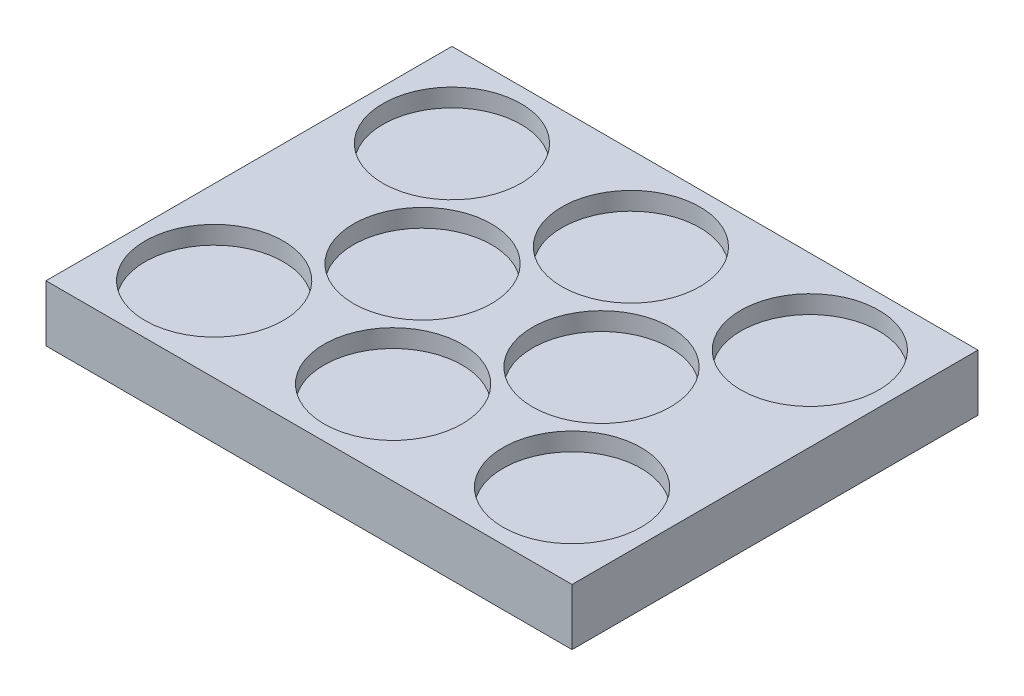
ISO-10303-21;
HEADER;
FILE_DESCRIPTION(('STEP AP214'),'2;1');
FILE_NAME('part.step','',(''),(''),'','','');
FILE_SCHEMA(('AUTOMOTIVE_DESIGN { 1 0 10303 214 1 1 1 1 }'));
ENDSEC;
DATA;
#1=APPLICATION_CONTEXT('core data for automotive mechanical design processes');
#2=APPLICATION_PROTOCOL_DEFINITION('international standard','automotive_design',2000,#1);
#3=PRODUCT_CONTEXT('',#1,'mechanical');
#4=PRODUCT('Part','Part','',(#3));
#5=PRODUCT_RELATED_PRODUCT_CATEGORY('part','',(#4));
#6=PRODUCT_DEFINITION_FORMATION('','',#4);
#7=PRODUCT_DEFINITION_CONTEXT('part definition',#1,'design');
#8=PRODUCT_DEFINITION('design','',#6,#7);
#9=PRODUCT_DEFINITION_SHAPE('','',#8);
#10=(LENGTH_UNIT() NAMED_UNIT(*) SI_UNIT(.MILLI.,.METRE.));
#11=(NAMED_UNIT(*) PLANE_ANGLE_UNIT() SI_UNIT($,.RADIAN.));
#12=(NAMED_UNIT(*) SI_UNIT($,.STERADIAN.) SOLID_ANGLE_UNIT());
#13=UNCERTAINTY_MEASURE_WITH_UNIT(LENGTH_MEASURE(1.E-05),#10,'distance_accuracy_value','');
#14=(GEOMETRIC_REPRESENTATION_CONTEXT(3) GLOBAL_UNCERTAINTY_ASSIGNED_CONTEXT((#13)) GLOBAL_UNIT_ASSIGNED_CONTEXT((#10,
#11,#12)) REPRESENTATION_CONTEXT('',''));
#15=CARTESIAN_POINT('',(0.,0.,0.));
#16=DIRECTION('',(0.,0.,1.));
#17=DIRECTION('',(1.,0.,0.));
#18=AXIS2_PLACEMENT_3D('',#15,#16,#17);
#19=CARTESIAN_POINT('',(219.,47.,169.));
#20=DIRECTION('',(-1.,0.,0.));
#21=DIRECTION('',(0.,0.,1.));
#22=AXIS2_PLACEMENT_3D('',#19,#20,#21);
#23=PLANE('',#22);
#24=DIRECTION('',(0.,0.,-1.));
#25=VECTOR('',#24,1.);
#26=CARTESIAN_POINT('',(219.,0.,169.));
#27=LINE('',#26,#25);
#28=CARTESIAN_POINT('',(219.,0.,169.));
#29=VERTEX_POINT('',#28);
#30=CARTESIAN_POINT('',(219.,0.,-169.));
#31=VERTEX_POINT('',#30);
#32=EDGE_CURVE('E98',#29,#31,#27,.T.);
#33=ORIENTED_EDGE('',*,*,#32,.T.);
#34=DIRECTION('',(0.,-1.,0.));
#35=VECTOR('',#34,1.);
#36=CARTESIAN_POINT('',(219.,47.,-169.));
#37=LINE('',#36,#35);
#38=CARTESIAN_POINT('',(219.,47.,-169.));
#39=VERTEX_POINT('',#38);
#40=EDGE_CURVE('E11',#39,#31,#37,.T.);
#41=ORIENTED_EDGE('',*,*,#40,.F.);
#42=DIRECTION('',(0.,0.,-1.));
#43=VECTOR('',#42,1.);
#44=CARTESIAN_POINT('',(219.,47.,169.));
#45=LINE('',#44,#43);
#46=CARTESIAN_POINT('',(219.,47.,169.));
#47=VERTEX_POINT('',#46);
#48=EDGE_CURVE('E86',#47,#39,#45,.T.);
#49=ORIENTED_EDGE('',*,*,#48,.F.);
#50=DIRECTION('',(0.,-1.,0.));
#51=VECTOR('',#50,1.);
#52=CARTESIAN_POINT('',(219.,47.,169.));
#53=LINE('',#52,#51);
#54=EDGE_CURVE('E94',#47,#29,#53,.T.);
#55=ORIENTED_EDGE('',*,*,#54,.T.);
#56=EDGE_LOOP('',(#33,#41,#49,#55));
#57=FACE_BOUND('',#56,.T.);
#58=ADVANCED_FACE('F35',(#57),#23,.F.);
#59=CARTESIAN_POINT('',(-219.,47.,-169.));
#60=DIRECTION('',(0.,0.,1.));
#61=DIRECTION('',(1.,0.,0.));
#62=AXIS2_PLACEMENT_3D('',#59,#60,#61);
#63=PLANE('',#62);
#64=DIRECTION('',(-1.,0.,0.));
#65=VECTOR('',#64,1.);
#66=CARTESIAN_POINT('',(-219.,0.,-169.));
#67=LINE('',#66,#65);
#68=CARTESIAN_POINT('',(-219.,0.,-169.));
#69=VERTEX_POINT('',#68);
#70=EDGE_CURVE('E90',#31,#69,#67,.T.);
#71=ORIENTED_EDGE('',*,*,#70,.T.);
#72=DIRECTION('',(0.,-1.,0.));
#73=VECTOR('',#72,1.);
#74=CARTESIAN_POINT('',(-219.,47.,-169.));
#75=LINE('',#74,#73);
#76=CARTESIAN_POINT('',(-219.,47.,-169.));
#77=VERTEX_POINT('',#76);
#78=EDGE_CURVE('E43',#77,#69,#75,.T.);
#79=ORIENTED_EDGE('',*,*,#78,.F.);
#80=DIRECTION('',(-1.,0.,0.));
#81=VECTOR('',#80,1.);
#82=CARTESIAN_POINT('',(-219.,47.,-169.));
#83=LINE('',#82,#81);
#84=EDGE_CURVE('E81',#39,#77,#83,.T.);
#85=ORIENTED_EDGE('',*,*,#84,.F.);
#86=ORIENTED_EDGE('',*,*,#40,.T.);
#87=EDGE_LOOP('',(#71,#79,#85,#86));
#88=FACE_BOUND('',#87,.T.);
#89=ADVANCED_FACE('F89',(#88),#63,.F.);
#90=CARTESIAN_POINT('',(-219.,47.,169.));
#91=DIRECTION('',(1.,0.,0.));
#92=DIRECTION('',(0.,0.,-1.));
#93=AXIS2_PLACEMENT_3D('',#90,#91,#92);
#94=PLANE('',#93);
#95=DIRECTION('',(0.,0.,1.));
#96=VECTOR('',#95,1.);
#97=CARTESIAN_POINT('',(-219.,0.,169.));
#98=LINE('',#97,#96);
#99=CARTESIAN_POINT('',(-219.,0.,169.));
#100=VERTEX_POINT('',#99);
#101=EDGE_CURVE('E68',#69,#100,#98,.T.);
#102=ORIENTED_EDGE('',*,*,#101,.T.);
#103=DIRECTION('',(0.,-1.,0.));
#104=VECTOR('',#103,1.);
#105=CARTESIAN_POINT('',(-219.,47.,169.));
#106=LINE('',#105,#104);
#107=CARTESIAN_POINT('',(-219.,47.,169.));
#108=VERTEX_POINT('',#107);
#109=EDGE_CURVE('E91',#108,#100,#106,.T.);
#110=ORIENTED_EDGE('',*,*,#109,.F.);
#111=DIRECTION('',(0.,0.,1.));
#112=VECTOR('',#111,1.);
#113=CARTESIAN_POINT('',(-219.,47.,169.));
#114=LINE('',#113,#112);
#115=EDGE_CURVE('E84',#77,#108,#114,.T.);
#116=ORIENTED_EDGE('',*,*,#115,.F.);
#117=ORIENTED_EDGE('',*,*,#78,.T.);
#118=EDGE_LOOP('',(#102,#110,#116,#117));
#119=FACE_BOUND('',#118,.T.);
#120=ADVANCED_FACE('F92',(#119),#94,.F.);
#121=CARTESIAN_POINT('',(-219.,47.,169.));
#122=DIRECTION('',(0.,0.,-1.));
#123=DIRECTION('',(-1.,0.,0.));
#124=AXIS2_PLACEMENT_3D('',#121,#122,#123);
#125=PLANE('',#124);
#126=DIRECTION('',(1.,0.,0.));
#127=VECTOR('',#126,1.);
#128=CARTESIAN_POINT('',(-219.,0.,169.));
#129=LINE('',#128,#127);
#130=EDGE_CURVE('E74',#100,#29,#129,.T.);
#131=ORIENTED_EDGE('',*,*,#130,.T.);
#132=ORIENTED_EDGE('',*,*,#54,.F.);
#133=DIRECTION('',(1.,0.,0.));
#134=VECTOR('',#133,1.);
#135=CARTESIAN_POINT('',(-219.,47.,169.));
#136=LINE('',#135,#134);
#137=EDGE_CURVE('E51',#108,#47,#136,.T.);
#138=ORIENTED_EDGE('',*,*,#137,.F.);
#139=ORIENTED_EDGE('',*,*,#109,.T.);
#140=EDGE_LOOP('',(#131,#132,#138,#139));
#141=FACE_BOUND('',#140,.T.);
#142=ADVANCED_FACE('F106',(#141),#125,.F.);
#143=CARTESIAN_POINT('',(0.,47.,0.));
#144=DIRECTION('',(0.,-1.,0.));
#145=DIRECTION('',(0.,0.,-1.));
#146=AXIS2_PLACEMENT_3D('',#143,#144,#145);
#147=PLANE('',#146);
#148=CARTESIAN_POINT('',(-149.,47.,99.));
#149=DIRECTION('',(0.,1.,0.));
#150=DIRECTION('',(0.,0.,1.));
#151=AXIS2_PLACEMENT_3D('',#148,#149,#150);
#152=CIRCLE('',#151,57.5);
#153=CARTESIAN_POINT('',(-149.,47.,156.5));
#154=VERTEX_POINT('',#153);
#155=EDGE_CURVE('E130',#154,#154,#152,.T.);
#156=ORIENTED_EDGE('',*,*,#155,.F.);
#157=EDGE_LOOP('',(#156));
#158=FACE_BOUND('',#157,.T.);
#159=CARTESIAN_POINT('',(-74.4999999999989,47.,0.));
#160=DIRECTION('',(0.,1.,0.));
#161=DIRECTION('',(0.,0.,1.));
#162=AXIS2_PLACEMENT_3D('',#159,#160,#161);
#163=CIRCLE('',#162,57.5);
#164=CARTESIAN_POINT('',(-74.4999999999989,47.,57.5));
#165=VERTEX_POINT('',#164);
#166=EDGE_CURVE('E136',#165,#165,#163,.T.);
#167=ORIENTED_EDGE('',*,*,#166,.F.);
#168=EDGE_LOOP('',(#167));
#169=FACE_BOUND('',#168,.T.);
#170=CARTESIAN_POINT('',(2.09381123550401E-12,47.,99.));
#171=DIRECTION('',(0.,1.,0.));
#172=DIRECTION('',(0.,0.,1.));
#173=AXIS2_PLACEMENT_3D('',#170,#171,#172);
#174=CIRCLE('',#173,57.5);
#175=CARTESIAN_POINT('',(2.09381123550401E-12,47.,156.5));
#176=VERTEX_POINT('',#175);
#177=EDGE_CURVE('E118',#176,#176,#174,.T.);
#178=ORIENTED_EDGE('',*,*,#177,.F.);
#179=EDGE_LOOP('',(#178));
#180=FACE_BOUND('',#179,.T.);
#181=CARTESIAN_POINT('',(-1.7503359872606E-12,47.,-99.));
#182=DIRECTION('',(0.,1.,0.));
#183=DIRECTION('',(0.,0.,1.));
#184=AXIS2_PLACEMENT_3D('',#181,#182,#183);
#185=CIRCLE('',#184,57.5);
#186=CARTESIAN_POINT('',(-1.7503359872606E-12,47.,-41.5));
#187=VERTEX_POINT('',#186);
#188=EDGE_CURVE('E125',#187,#187,#185,.T.);
#189=ORIENTED_EDGE('',*,*,#188,.F.);
#190=EDGE_LOOP('',(#189));
#191=FACE_BOUND('',#190,.T.);
#192=CARTESIAN_POINT('',(74.5000000000011,47.,0.));
#193=DIRECTION('',(0.,1.,0.));
#194=DIRECTION('',(0.,0.,1.));
#195=AXIS2_PLACEMENT_3D('',#192,#193,#194);
#196=CIRCLE('',#195,57.5);
#197=CARTESIAN_POINT('',(74.5000000000011,47.,57.5));
#198=VERTEX_POINT('',#197);
#199=EDGE_CURVE('E154',#198,#198,#196,.T.);
#200=ORIENTED_EDGE('',*,*,#199,.F.);
#201=EDGE_LOOP('',(#200));
#202=FACE_BOUND('',#201,.T.);
#203=CARTESIAN_POINT('',(149.,47.,99.));
#204=DIRECTION('',(0.,1.,0.));
#205=DIRECTION('',(0.,0.,1.));
#206=AXIS2_PLACEMENT_3D('',#203,#204,#205);
#207=CIRCLE('',#206,57.5);
#208=CARTESIAN_POINT('',(149.,47.,156.5));
#209=VERTEX_POINT('',#208);
#210=EDGE_CURVE('E142',#209,#209,#207,.T.);
#211=ORIENTED_EDGE('',*,*,#210,.F.);
#212=EDGE_LOOP('',(#211));
#213=FACE_BOUND('',#212,.T.);
#214=CARTESIAN_POINT('',(149.,47.,-99.));
#215=DIRECTION('',(0.,1.,0.));
#216=DIRECTION('',(0.,0.,1.));
#217=AXIS2_PLACEMENT_3D('',#214,#215,#216);
#218=CIRCLE('',#217,57.5);
#219=CARTESIAN_POINT('',(149.,47.,-41.5));
#220=VERTEX_POINT('',#219);
#221=EDGE_CURVE('E149',#220,#220,#218,.T.);
#222=ORIENTED_EDGE('',*,*,#221,.F.);
#223=EDGE_LOOP('',(#222));
#224=FACE_BOUND('',#223,.T.);
#225=CARTESIAN_POINT('',(-149.,47.,-99.));
#226=DIRECTION('',(0.,1.,0.));
#227=DIRECTION('',(0.,0.,1.));
#228=AXIS2_PLACEMENT_3D('',#225,#226,#227);
#229=CIRCLE('',#228,57.5);
#230=CARTESIAN_POINT('',(-149.,47.,-41.5));
#231=VERTEX_POINT('',#230);
#232=EDGE_CURVE('E112',#231,#231,#229,.T.);
#233=ORIENTED_EDGE('',*,*,#232,.F.);
#234=EDGE_LOOP('',(#233));
#235=FACE_BOUND('',#234,.T.);
#236=ORIENTED_EDGE('',*,*,#48,.T.);
#237=ORIENTED_EDGE('',*,*,#84,.T.);
#238=ORIENTED_EDGE('',*,*,#115,.T.);
#239=ORIENTED_EDGE('',*,*,#137,.T.);
#240=EDGE_LOOP('',(#236,#237,#238,#239));
#241=FACE_BOUND('',#240,.T.);
#242=ADVANCED_FACE('F82',(#158,#169,#180,#191,#202,#213,#224,#235,#241),#147,.F.);
#243=CARTESIAN_POINT('',(0.,0.,0.));
#244=DIRECTION('',(0.,-1.,0.));
#245=DIRECTION('',(0.,0.,-1.));
#246=AXIS2_PLACEMENT_3D('',#243,#244,#245);
#247=PLANE('',#246);
#248=ORIENTED_EDGE('',*,*,#32,.F.);
#249=ORIENTED_EDGE('',*,*,#130,.F.);
#250=ORIENTED_EDGE('',*,*,#101,.F.);
#251=ORIENTED_EDGE('',*,*,#70,.F.);
#252=EDGE_LOOP('',(#248,#249,#250,#251));
#253=FACE_BOUND('',#252,.T.);
#254=ADVANCED_FACE('F109',(#253),#247,.T.);
#255=CARTESIAN_POINT('',(-149.,32.,-99.));
#256=DIRECTION('',(0.,1.,0.));
#257=DIRECTION('',(0.,0.,1.));
#258=AXIS2_PLACEMENT_3D('',#255,#256,#257);
#259=CYLINDRICAL_SURFACE('',#258,57.5);
#260=CARTESIAN_POINT('',(-149.,32.,-99.));
#261=DIRECTION('',(0.,1.,0.));
#262=DIRECTION('',(0.,0.,1.));
#263=AXIS2_PLACEMENT_3D('',#260,#261,#262);
#264=CIRCLE('',#263,57.5);
#265=CARTESIAN_POINT('',(-149.,32.,-41.5));
#266=VERTEX_POINT('',#265);
#267=EDGE_CURVE('E101',#266,#266,#264,.T.);
#268=ORIENTED_EDGE('',*,*,#267,.F.);
#269=EDGE_LOOP('',(#268));
#270=FACE_BOUND('',#269,.T.);
#271=ORIENTED_EDGE('',*,*,#232,.T.);
#272=EDGE_LOOP('',(#271));
#273=FACE_BOUND('',#272,.T.);
#274=ADVANCED_FACE('F179',(#270,#273),#259,.F.);
#275=CARTESIAN_POINT('',(-149.,32.,-99.));
#276=DIRECTION('',(0.,1.,0.));
#277=DIRECTION('',(0.,0.,1.));
#278=AXIS2_PLACEMENT_3D('',#275,#276,#277);
#279=PLANE('',#278);
#280=ORIENTED_EDGE('',*,*,#267,.T.);
#281=EDGE_LOOP('',(#280));
#282=FACE_BOUND('',#281,.T.);
#283=ADVANCED_FACE('F181',(#282),#279,.T.);
#284=CARTESIAN_POINT('',(149.,32.,-99.));
#285=DIRECTION('',(0.,1.,0.));
#286=DIRECTION('',(0.,0.,1.));
#287=AXIS2_PLACEMENT_3D('',#284,#285,#286);
#288=CYLINDRICAL_SURFACE('',#287,57.5);
#289=CARTESIAN_POINT('',(149.,32.,-99.));
#290=DIRECTION('',(0.,1.,0.));
#291=DIRECTION('',(0.,0.,1.));
#292=AXIS2_PLACEMENT_3D('',#289,#290,#291);
#293=CIRCLE('',#292,57.5);
#294=CARTESIAN_POINT('',(149.,32.,-41.5));
#295=VERTEX_POINT('',#294);
#296=EDGE_CURVE('E139',#295,#295,#293,.T.);
#297=ORIENTED_EDGE('',*,*,#296,.F.);
#298=EDGE_LOOP('',(#297));
#299=FACE_BOUND('',#298,.T.);
#300=ORIENTED_EDGE('',*,*,#221,.T.);
#301=EDGE_LOOP('',(#300));
#302=FACE_BOUND('',#301,.T.);
#303=ADVANCED_FACE('F188',(#299,#302),#288,.F.);
#304=CARTESIAN_POINT('',(149.,32.,-99.));
#305=DIRECTION('',(0.,1.,0.));
#306=DIRECTION('',(0.,0.,1.));
#307=AXIS2_PLACEMENT_3D('',#304,#305,#306);
#308=PLANE('',#307);
#309=ORIENTED_EDGE('',*,*,#296,.T.);
#310=EDGE_LOOP('',(#309));
#311=FACE_BOUND('',#310,.T.);
#312=ADVANCED_FACE('F236',(#311),#308,.T.);
#313=CARTESIAN_POINT('',(149.,32.,99.));
#314=DIRECTION('',(0.,1.,0.));
#315=DIRECTION('',(0.,0.,1.));
#316=AXIS2_PLACEMENT_3D('',#313,#314,#315);
#317=CYLINDRICAL_SURFACE('',#316,57.5);
#318=CARTESIAN_POINT('',(149.,32.,99.));
#319=DIRECTION('',(0.,1.,0.));
#320=DIRECTION('',(0.,0.,1.));
#321=AXIS2_PLACEMENT_3D('',#318,#319,#320);
#322=CIRCLE('',#321,57.5);
#323=CARTESIAN_POINT('',(149.,32.,156.5));
#324=VERTEX_POINT('',#323);
#325=EDGE_CURVE('E145',#324,#324,#322,.T.);
#326=ORIENTED_EDGE('',*,*,#325,.F.);
#327=EDGE_LOOP('',(#326));
#328=FACE_BOUND('',#327,.T.);
#329=ORIENTED_EDGE('',*,*,#210,.T.);
#330=EDGE_LOOP('',(#329));
#331=FACE_BOUND('',#330,.T.);
#332=ADVANCED_FACE('F245',(#328,#331),#317,.F.);
#333=CARTESIAN_POINT('',(149.,32.,99.));
#334=DIRECTION('',(0.,1.,0.));
#335=DIRECTION('',(0.,0.,1.));
#336=AXIS2_PLACEMENT_3D('',#333,#334,#335);
#337=PLANE('',#336);
#338=ORIENTED_EDGE('',*,*,#325,.T.);
#339=EDGE_LOOP('',(#338));
#340=FACE_BOUND('',#339,.T.);
#341=ADVANCED_FACE('F165',(#340),#337,.T.);
#342=CARTESIAN_POINT('',(74.5000000000011,32.,0.));
#343=DIRECTION('',(0.,1.,0.));
#344=DIRECTION('',(0.,0.,1.));
#345=AXIS2_PLACEMENT_3D('',#342,#343,#344);
#346=CYLINDRICAL_SURFACE('',#345,57.5);
#347=CARTESIAN_POINT('',(74.5000000000011,32.,0.));
#348=DIRECTION('',(0.,1.,0.));
#349=DIRECTION('',(0.,0.,1.));
#350=AXIS2_PLACEMENT_3D('',#347,#348,#349);
#351=CIRCLE('',#350,57.5);
#352=CARTESIAN_POINT('',(74.5000000000011,32.,57.5));
#353=VERTEX_POINT('',#352);
#354=EDGE_CURVE('E146',#353,#353,#351,.T.);
#355=ORIENTED_EDGE('',*,*,#354,.F.);
#356=EDGE_LOOP('',(#355));
#357=FACE_BOUND('',#356,.T.);
#358=ORIENTED_EDGE('',*,*,#199,.T.);
#359=EDGE_LOOP('',(#358));
#360=FACE_BOUND('',#359,.T.);
#361=ADVANCED_FACE('F162',(#357,#360),#346,.F.);
#362=CARTESIAN_POINT('',(74.5000000000011,32.,0.));
#363=DIRECTION('',(0.,1.,0.));
#364=DIRECTION('',(0.,0.,1.));
#365=AXIS2_PLACEMENT_3D('',#362,#363,#364);
#366=PLANE('',#365);
#367=ORIENTED_EDGE('',*,*,#354,.T.);
#368=EDGE_LOOP('',(#367));
#369=FACE_BOUND('',#368,.T.);
#370=ADVANCED_FACE('F160',(#369),#366,.T.);
#371=CARTESIAN_POINT('',(-1.7503359872606E-12,32.,-99.));
#372=DIRECTION('',(0.,1.,0.));
#373=DIRECTION('',(0.,0.,1.));
#374=AXIS2_PLACEMENT_3D('',#371,#372,#373);
#375=CYLINDRICAL_SURFACE('',#374,57.5);
#376=CARTESIAN_POINT('',(-1.7503359872606E-12,32.,-99.));
#377=DIRECTION('',(0.,1.,0.));
#378=DIRECTION('',(0.,0.,1.));
#379=AXIS2_PLACEMENT_3D('',#376,#377,#378);
#380=CIRCLE('',#379,57.5);
#381=CARTESIAN_POINT('',(-1.7503359872606E-12,32.,-41.5));
#382=VERTEX_POINT('',#381);
#383=EDGE_CURVE('E115',#382,#382,#380,.T.);
#384=ORIENTED_EDGE('',*,*,#383,.F.);
#385=EDGE_LOOP('',(#384));
#386=FACE_BOUND('',#385,.T.);
#387=ORIENTED_EDGE('',*,*,#188,.T.);
#388=EDGE_LOOP('',(#387));
#389=FACE_BOUND('',#388,.T.);
#390=ADVANCED_FACE('F275',(#386,#389),#375,.F.);
#391=CARTESIAN_POINT('',(-1.7503359872606E-12,32.,-99.));
#392=DIRECTION('',(0.,1.,0.));
#393=DIRECTION('',(0.,0.,1.));
#394=AXIS2_PLACEMENT_3D('',#391,#392,#393);
#395=PLANE('',#394);
#396=ORIENTED_EDGE('',*,*,#383,.T.);
#397=EDGE_LOOP('',(#396));
#398=FACE_BOUND('',#397,.T.);
#399=ADVANCED_FACE('F283',(#398),#395,.T.);
#400=CARTESIAN_POINT('',(2.09381123550401E-12,32.,99.));
#401=DIRECTION('',(0.,1.,0.));
#402=DIRECTION('',(0.,0.,1.));
#403=AXIS2_PLACEMENT_3D('',#400,#401,#402);
#404=CYLINDRICAL_SURFACE('',#403,57.5);
#405=CARTESIAN_POINT('',(2.09381123550401E-12,32.,99.));
#406=DIRECTION('',(0.,1.,0.));
#407=DIRECTION('',(0.,0.,1.));
#408=AXIS2_PLACEMENT_3D('',#405,#406,#407);
#409=CIRCLE('',#408,57.5);
#410=CARTESIAN_POINT('',(2.09381123550401E-12,32.,156.5));
#411=VERTEX_POINT('',#410);
#412=EDGE_CURVE('E121',#411,#411,#409,.T.);
#413=ORIENTED_EDGE('',*,*,#412,.F.);
#414=EDGE_LOOP('',(#413));
#415=FACE_BOUND('',#414,.T.);
#416=ORIENTED_EDGE('',*,*,#177,.T.);
#417=EDGE_LOOP('',(#416));
#418=FACE_BOUND('',#417,.T.);
#419=ADVANCED_FACE('F292',(#415,#418),#404,.F.);
#420=CARTESIAN_POINT('',(2.09381123550401E-12,32.,99.));
#421=DIRECTION('',(0.,1.,0.));
#422=DIRECTION('',(0.,0.,1.));
#423=AXIS2_PLACEMENT_3D('',#420,#421,#422);
#424=PLANE('',#423);
#425=ORIENTED_EDGE('',*,*,#412,.T.);
#426=EDGE_LOOP('',(#425));
#427=FACE_BOUND('',#426,.T.);
#428=ADVANCED_FACE('F301',(#427),#424,.T.);
#429=CARTESIAN_POINT('',(-74.4999999999989,32.,0.));
#430=DIRECTION('',(0.,1.,0.));
#431=DIRECTION('',(0.,0.,1.));
#432=AXIS2_PLACEMENT_3D('',#429,#430,#431);
#433=CYLINDRICAL_SURFACE('',#432,57.5);
#434=CARTESIAN_POINT('',(-74.4999999999989,32.,0.));
#435=DIRECTION('',(0.,1.,0.));
#436=DIRECTION('',(0.,0.,1.));
#437=AXIS2_PLACEMENT_3D('',#434,#435,#436);
#438=CIRCLE('',#437,57.5);
#439=CARTESIAN_POINT('',(-74.4999999999989,32.,57.5));
#440=VERTEX_POINT('',#439);
#441=EDGE_CURVE('E133',#440,#440,#438,.T.);
#442=ORIENTED_EDGE('',*,*,#441,.F.);
#443=EDGE_LOOP('',(#442));
#444=FACE_BOUND('',#443,.T.);
#445=ORIENTED_EDGE('',*,*,#166,.T.);
#446=EDGE_LOOP('',(#445));
#447=FACE_BOUND('',#446,.T.);
#448=ADVANCED_FACE('F310',(#444,#447),#433,.F.);
#449=CARTESIAN_POINT('',(-74.4999999999989,32.,0.));
#450=DIRECTION('',(0.,1.,0.));
#451=DIRECTION('',(0.,0.,1.));
#452=AXIS2_PLACEMENT_3D('',#449,#450,#451);
#453=PLANE('',#452);
#454=ORIENTED_EDGE('',*,*,#441,.T.);
#455=EDGE_LOOP('',(#454));
#456=FACE_BOUND('',#455,.T.);
#457=ADVANCED_FACE('F319',(#456),#453,.T.);
#458=CARTESIAN_POINT('',(-149.,32.,99.));
#459=DIRECTION('',(0.,1.,0.));
#460=DIRECTION('',(0.,0.,1.));
#461=AXIS2_PLACEMENT_3D('',#458,#459,#460);
#462=CYLINDRICAL_SURFACE('',#461,57.5);
#463=CARTESIAN_POINT('',(-149.,32.,99.));
#464=DIRECTION('',(0.,1.,0.));
#465=DIRECTION('',(0.,0.,1.));
#466=AXIS2_PLACEMENT_3D('',#463,#464,#465);
#467=CIRCLE('',#466,57.5);
#468=CARTESIAN_POINT('',(-149.,32.,156.5));
#469=VERTEX_POINT('',#468);
#470=EDGE_CURVE('E122',#469,#469,#467,.T.);
#471=ORIENTED_EDGE('',*,*,#470,.F.);
#472=EDGE_LOOP('',(#471));
#473=FACE_BOUND('',#472,.T.);
#474=ORIENTED_EDGE('',*,*,#155,.T.);
#475=EDGE_LOOP('',(#474));
#476=FACE_BOUND('',#475,.T.);
#477=ADVANCED_FACE('F328',(#473,#476),#462,.F.);
#478=CARTESIAN_POINT('',(-149.,32.,99.));
#479=DIRECTION('',(0.,1.,0.));
#480=DIRECTION('',(0.,0.,1.));
#481=AXIS2_PLACEMENT_3D('',#478,#479,#480);
#482=PLANE('',#481);
#483=ORIENTED_EDGE('',*,*,#470,.T.);
#484=EDGE_LOOP('',(#483));
#485=FACE_BOUND('',#484,.T.);
#486=ADVANCED_FACE('F337',(#485),#482,.T.);
#487=CLOSED_SHELL('',(#58,#89,#120,#142,#242,#254,#274,#283,#303,#312,#332,#341,#361,#370,#390,
#399,#419,#428,#448,#457,#477,#486));
#488=MANIFOLD_SOLID_BREP('B2',#487);
#489=ADVANCED_BREP_SHAPE_REPRESENTATION('',(#18,#488),#14);
#490=SHAPE_DEFINITION_REPRESENTATION(#9,#489);
ENDSEC;
END-ISO-10303-21;
